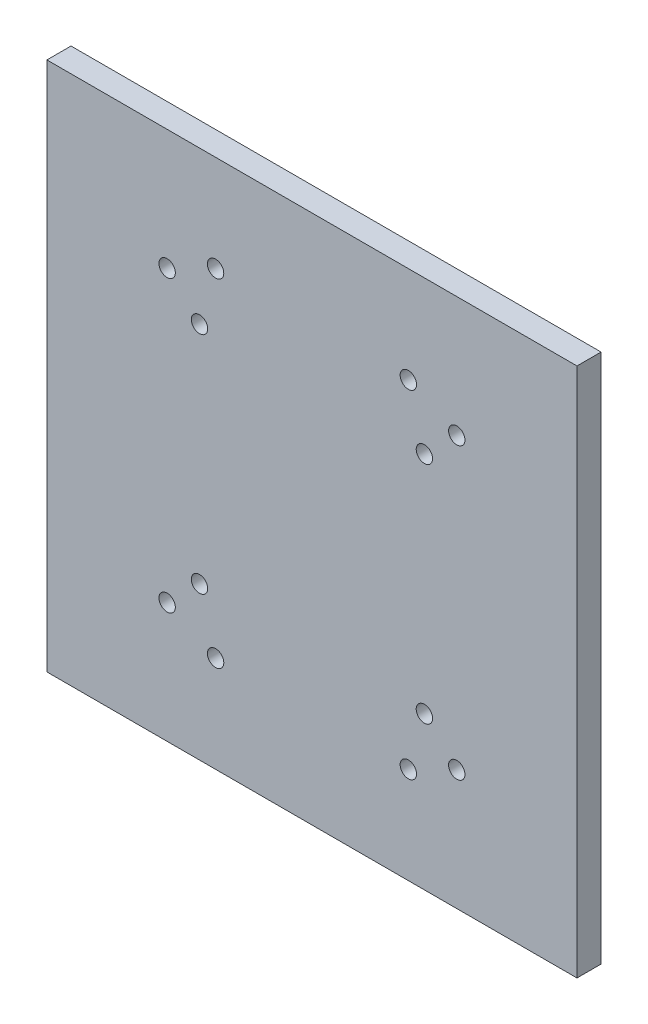
ISO-10303-21;
HEADER;
FILE_DESCRIPTION(('STEP AP214'),'2;1');
FILE_NAME('part.step','',(''),(''),'','','');
FILE_SCHEMA(('AUTOMOTIVE_DESIGN { 1 0 10303 214 1 1 1 1 }'));
ENDSEC;
DATA;
#1=APPLICATION_CONTEXT('core data for automotive mechanical design processes');
#2=APPLICATION_PROTOCOL_DEFINITION('international standard','automotive_design',2000,#1);
#3=PRODUCT_CONTEXT('',#1,'mechanical');
#4=PRODUCT('Part','Part','',(#3));
#5=PRODUCT_RELATED_PRODUCT_CATEGORY('part','',(#4));
#6=PRODUCT_DEFINITION_FORMATION('','',#4);
#7=PRODUCT_DEFINITION_CONTEXT('part definition',#1,'design');
#8=PRODUCT_DEFINITION('design','',#6,#7);
#9=PRODUCT_DEFINITION_SHAPE('','',#8);
#10=(LENGTH_UNIT() NAMED_UNIT(*) SI_UNIT(.MILLI.,.METRE.));
#11=(NAMED_UNIT(*) PLANE_ANGLE_UNIT() SI_UNIT($,.RADIAN.));
#12=(NAMED_UNIT(*) SI_UNIT($,.STERADIAN.) SOLID_ANGLE_UNIT());
#13=UNCERTAINTY_MEASURE_WITH_UNIT(LENGTH_MEASURE(1.E-05),#10,'distance_accuracy_value','');
#14=(GEOMETRIC_REPRESENTATION_CONTEXT(3) GLOBAL_UNCERTAINTY_ASSIGNED_CONTEXT((#13)) GLOBAL_UNIT_ASSIGNED_CONTEXT((#10,
#11,#12)) REPRESENTATION_CONTEXT('',''));
#15=CARTESIAN_POINT('',(0.,0.,0.));
#16=DIRECTION('',(0.,0.,1.));
#17=DIRECTION('',(1.,0.,0.));
#18=AXIS2_PLACEMENT_3D('',#15,#16,#17);
#19=CARTESIAN_POINT('',(110.,-110.,10.));
#20=DIRECTION('',(-1.,0.,0.));
#21=DIRECTION('',(0.,0.,1.));
#22=AXIS2_PLACEMENT_3D('',#19,#20,#21);
#23=PLANE('',#22);
#24=DIRECTION('',(0.,1.,0.));
#25=VECTOR('',#24,1.);
#26=CARTESIAN_POINT('',(110.,-110.,0.));
#27=LINE('',#26,#25);
#28=CARTESIAN_POINT('',(110.,-110.,0.));
#29=VERTEX_POINT('',#28);
#30=CARTESIAN_POINT('',(110.,110.,0.));
#31=VERTEX_POINT('',#30);
#32=EDGE_CURVE('E106',#29,#31,#27,.T.);
#33=ORIENTED_EDGE('',*,*,#32,.T.);
#34=DIRECTION('',(0.,0.,-1.));
#35=VECTOR('',#34,1.);
#36=CARTESIAN_POINT('',(110.,110.,10.));
#37=LINE('',#36,#35);
#38=CARTESIAN_POINT('',(110.,110.,10.));
#39=VERTEX_POINT('',#38);
#40=EDGE_CURVE('E11',#39,#31,#37,.T.);
#41=ORIENTED_EDGE('',*,*,#40,.F.);
#42=DIRECTION('',(0.,1.,0.));
#43=VECTOR('',#42,1.);
#44=CARTESIAN_POINT('',(110.,-110.,10.));
#45=LINE('',#44,#43);
#46=CARTESIAN_POINT('',(110.,-110.,10.));
#47=VERTEX_POINT('',#46);
#48=EDGE_CURVE('E90',#47,#39,#45,.T.);
#49=ORIENTED_EDGE('',*,*,#48,.F.);
#50=DIRECTION('',(0.,0.,-1.));
#51=VECTOR('',#50,1.);
#52=CARTESIAN_POINT('',(110.,-110.,10.));
#53=LINE('',#52,#51);
#54=EDGE_CURVE('E102',#47,#29,#53,.T.);
#55=ORIENTED_EDGE('',*,*,#54,.T.);
#56=EDGE_LOOP('',(#33,#41,#49,#55));
#57=FACE_BOUND('',#56,.T.);
#58=ADVANCED_FACE('F38',(#57),#23,.F.);
#59=CARTESIAN_POINT('',(-110.,110.,10.));
#60=DIRECTION('',(0.,-1.,0.));
#61=DIRECTION('',(0.,0.,-1.));
#62=AXIS2_PLACEMENT_3D('',#59,#60,#61);
#63=PLANE('',#62);
#64=DIRECTION('',(-1.,0.,0.));
#65=VECTOR('',#64,1.);
#66=CARTESIAN_POINT('',(-110.,110.,0.));
#67=LINE('',#66,#65);
#68=CARTESIAN_POINT('',(-110.,110.,0.));
#69=VERTEX_POINT('',#68);
#70=EDGE_CURVE('E95',#31,#69,#67,.T.);
#71=ORIENTED_EDGE('',*,*,#70,.T.);
#72=DIRECTION('',(0.,0.,-1.));
#73=VECTOR('',#72,1.);
#74=CARTESIAN_POINT('',(-110.,110.,10.));
#75=LINE('',#74,#73);
#76=CARTESIAN_POINT('',(-110.,110.,10.));
#77=VERTEX_POINT('',#76);
#78=EDGE_CURVE('E47',#77,#69,#75,.T.);
#79=ORIENTED_EDGE('',*,*,#78,.F.);
#80=DIRECTION('',(-1.,0.,0.));
#81=VECTOR('',#80,1.);
#82=CARTESIAN_POINT('',(-110.,110.,10.));
#83=LINE('',#82,#81);
#84=EDGE_CURVE('E85',#39,#77,#83,.T.);
#85=ORIENTED_EDGE('',*,*,#84,.F.);
#86=ORIENTED_EDGE('',*,*,#40,.T.);
#87=EDGE_LOOP('',(#71,#79,#85,#86));
#88=FACE_BOUND('',#87,.T.);
#89=ADVANCED_FACE('F94',(#88),#63,.F.);
#90=CARTESIAN_POINT('',(-110.,-110.,10.));
#91=DIRECTION('',(1.,0.,0.));
#92=DIRECTION('',(0.,0.,-1.));
#93=AXIS2_PLACEMENT_3D('',#90,#91,#92);
#94=PLANE('',#93);
#95=DIRECTION('',(0.,-1.,0.));
#96=VECTOR('',#95,1.);
#97=CARTESIAN_POINT('',(-110.,-110.,0.));
#98=LINE('',#97,#96);
#99=CARTESIAN_POINT('',(-110.,-110.,0.));
#100=VERTEX_POINT('',#99);
#101=EDGE_CURVE('E72',#69,#100,#98,.T.);
#102=ORIENTED_EDGE('',*,*,#101,.T.);
#103=DIRECTION('',(0.,0.,-1.));
#104=VECTOR('',#103,1.);
#105=CARTESIAN_POINT('',(-110.,-110.,10.));
#106=LINE('',#105,#104);
#107=CARTESIAN_POINT('',(-110.,-110.,10.));
#108=VERTEX_POINT('',#107);
#109=EDGE_CURVE('E97',#108,#100,#106,.T.);
#110=ORIENTED_EDGE('',*,*,#109,.F.);
#111=DIRECTION('',(0.,-1.,0.));
#112=VECTOR('',#111,1.);
#113=CARTESIAN_POINT('',(-110.,-110.,10.));
#114=LINE('',#113,#112);
#115=EDGE_CURVE('E88',#77,#108,#114,.T.);
#116=ORIENTED_EDGE('',*,*,#115,.F.);
#117=ORIENTED_EDGE('',*,*,#78,.T.);
#118=EDGE_LOOP('',(#102,#110,#116,#117));
#119=FACE_BOUND('',#118,.T.);
#120=ADVANCED_FACE('F98',(#119),#94,.F.);
#121=CARTESIAN_POINT('',(-110.,-110.,10.));
#122=DIRECTION('',(0.,1.,0.));
#123=DIRECTION('',(0.,0.,1.));
#124=AXIS2_PLACEMENT_3D('',#121,#122,#123);
#125=PLANE('',#124);
#126=DIRECTION('',(1.,0.,0.));
#127=VECTOR('',#126,1.);
#128=CARTESIAN_POINT('',(-110.,-110.,0.));
#129=LINE('',#128,#127);
#130=EDGE_CURVE('E78',#100,#29,#129,.T.);
#131=ORIENTED_EDGE('',*,*,#130,.T.);
#132=ORIENTED_EDGE('',*,*,#54,.F.);
#133=DIRECTION('',(1.,0.,0.));
#134=VECTOR('',#133,1.);
#135=CARTESIAN_POINT('',(-110.,-110.,10.));
#136=LINE('',#135,#134);
#137=EDGE_CURVE('E55',#108,#47,#136,.T.);
#138=ORIENTED_EDGE('',*,*,#137,.F.);
#139=ORIENTED_EDGE('',*,*,#109,.T.);
#140=EDGE_LOOP('',(#131,#132,#138,#139));
#141=FACE_BOUND('',#140,.T.);
#142=ADVANCED_FACE('F120',(#141),#125,.F.);
#143=CARTESIAN_POINT('',(0.,0.,10.));
#144=DIRECTION('',(0.,0.,-1.));
#145=DIRECTION('',(-1.,0.,0.));
#146=AXIS2_PLACEMENT_3D('',#143,#144,#145);
#147=PLANE('',#146);
#148=CARTESIAN_POINT('',(-40.,-70.,10.));
#149=DIRECTION('',(0.,0.,1.));
#150=DIRECTION('',(-1.,0.,0.));
#151=AXIS2_PLACEMENT_3D('',#148,#149,#150);
#152=CIRCLE('',#151,3.4);
#153=CARTESIAN_POINT('',(-43.4,-70.,10.));
#154=VERTEX_POINT('',#153);
#155=EDGE_CURVE('E208',#154,#154,#152,.T.);
#156=ORIENTED_EDGE('',*,*,#155,.F.);
#157=EDGE_LOOP('',(#156));
#158=FACE_BOUND('',#157,.T.);
#159=CARTESIAN_POINT('',(40.,70.,10.));
#160=DIRECTION('',(0.,0.,1.));
#161=DIRECTION('',(-1.,0.,0.));
#162=AXIS2_PLACEMENT_3D('',#159,#160,#161);
#163=CIRCLE('',#162,3.4);
#164=CARTESIAN_POINT('',(36.6,70.,10.));
#165=VERTEX_POINT('',#164);
#166=EDGE_CURVE('E199',#165,#165,#163,.T.);
#167=ORIENTED_EDGE('',*,*,#166,.F.);
#168=EDGE_LOOP('',(#167));
#169=FACE_BOUND('',#168,.T.);
#170=CARTESIAN_POINT('',(-40.,70.,10.));
#171=DIRECTION('',(0.,0.,1.));
#172=DIRECTION('',(1.,0.,0.));
#173=AXIS2_PLACEMENT_3D('',#170,#171,#172);
#174=CIRCLE('',#173,3.4);
#175=CARTESIAN_POINT('',(-36.6,70.,10.));
#176=VERTEX_POINT('',#175);
#177=EDGE_CURVE('E215',#176,#176,#174,.T.);
#178=ORIENTED_EDGE('',*,*,#177,.F.);
#179=EDGE_LOOP('',(#178));
#180=FACE_BOUND('',#179,.T.);
#181=CARTESIAN_POINT('',(40.,-70.,10.));
#182=DIRECTION('',(0.,0.,1.));
#183=DIRECTION('',(1.,0.,0.));
#184=AXIS2_PLACEMENT_3D('',#181,#182,#183);
#185=CIRCLE('',#184,3.4);
#186=CARTESIAN_POINT('',(43.4,-70.,10.));
#187=VERTEX_POINT('',#186);
#188=EDGE_CURVE('E191',#187,#187,#185,.T.);
#189=ORIENTED_EDGE('',*,*,#188,.F.);
#190=EDGE_LOOP('',(#189));
#191=FACE_BOUND('',#190,.T.);
#192=CARTESIAN_POINT('',(46.6690475583122,-46.669047558312,10.));
#193=DIRECTION('',(0.,0.,1.));
#194=DIRECTION('',(1.,0.,0.));
#195=AXIS2_PLACEMENT_3D('',#192,#193,#194);
#196=CIRCLE('',#195,3.39999999999998);
#197=CARTESIAN_POINT('',(50.0690475583122,-46.669047558312,10.));
#198=VERTEX_POINT('',#197);
#199=EDGE_CURVE('E160',#198,#198,#196,.T.);
#200=ORIENTED_EDGE('',*,*,#199,.F.);
#201=EDGE_LOOP('',(#200));
#202=FACE_BOUND('',#201,.T.);
#203=CARTESIAN_POINT('',(-46.669047558312,-46.6690475583122,10.));
#204=DIRECTION('',(0.,0.,1.));
#205=DIRECTION('',(1.,0.,0.));
#206=AXIS2_PLACEMENT_3D('',#203,#204,#205);
#207=CIRCLE('',#206,3.4);
#208=CARTESIAN_POINT('',(-43.269047558312,-46.6690475583122,10.));
#209=VERTEX_POINT('',#208);
#210=EDGE_CURVE('E152',#209,#209,#207,.T.);
#211=ORIENTED_EDGE('',*,*,#210,.F.);
#212=EDGE_LOOP('',(#211));
#213=FACE_BOUND('',#212,.T.);
#214=CARTESIAN_POINT('',(-46.6690475583122,46.6690475583121,10.));
#215=DIRECTION('',(0.,0.,1.));
#216=DIRECTION('',(1.,0.,0.));
#217=AXIS2_PLACEMENT_3D('',#214,#215,#216);
#218=CIRCLE('',#217,3.4);
#219=CARTESIAN_POINT('',(-43.2690475583122,46.6690475583121,10.));
#220=VERTEX_POINT('',#219);
#221=EDGE_CURVE('E144',#220,#220,#218,.T.);
#222=ORIENTED_EDGE('',*,*,#221,.F.);
#223=EDGE_LOOP('',(#222));
#224=FACE_BOUND('',#223,.T.);
#225=CARTESIAN_POINT('',(60.1040764008565,60.1040764008565,10.));
#226=DIRECTION('',(0.,0.,1.));
#227=DIRECTION('',(1.,0.,0.));
#228=AXIS2_PLACEMENT_3D('',#225,#226,#227);
#229=CIRCLE('',#228,3.39999999999998);
#230=CARTESIAN_POINT('',(63.5040764008565,60.1040764008565,10.));
#231=VERTEX_POINT('',#230);
#232=EDGE_CURVE('E135',#231,#231,#229,.T.);
#233=ORIENTED_EDGE('',*,*,#232,.F.);
#234=EDGE_LOOP('',(#233));
#235=FACE_BOUND('',#234,.T.);
#236=CARTESIAN_POINT('',(60.1040764008563,-60.1040764008567,10.));
#237=DIRECTION('',(0.,0.,1.));
#238=DIRECTION('',(1.,0.,0.));
#239=AXIS2_PLACEMENT_3D('',#236,#237,#238);
#240=CIRCLE('',#239,3.39999999999999);
#241=CARTESIAN_POINT('',(63.5040764008563,-60.1040764008567,10.));
#242=VERTEX_POINT('',#241);
#243=EDGE_CURVE('E184',#242,#242,#240,.T.);
#244=ORIENTED_EDGE('',*,*,#243,.F.);
#245=EDGE_LOOP('',(#244));
#246=FACE_BOUND('',#245,.T.);
#247=CARTESIAN_POINT('',(-60.1040764008565,-60.1040764008566,10.));
#248=DIRECTION('',(0.,0.,1.));
#249=DIRECTION('',(1.,0.,0.));
#250=AXIS2_PLACEMENT_3D('',#247,#248,#249);
#251=CIRCLE('',#250,3.40000000000027);
#252=CARTESIAN_POINT('',(-56.7040764008563,-60.1040764008566,10.));
#253=VERTEX_POINT('',#252);
#254=EDGE_CURVE('E176',#253,#253,#251,.T.);
#255=ORIENTED_EDGE('',*,*,#254,.F.);
#256=EDGE_LOOP('',(#255));
#257=FACE_BOUND('',#256,.T.);
#258=CARTESIAN_POINT('',(-60.1040764008559,60.1040764008572,10.));
#259=DIRECTION('',(0.,0.,1.));
#260=DIRECTION('',(1.,0.,0.));
#261=AXIS2_PLACEMENT_3D('',#258,#259,#260);
#262=CIRCLE('',#261,3.39999999999999);
#263=CARTESIAN_POINT('',(-56.7040764008559,60.1040764008572,10.));
#264=VERTEX_POINT('',#263);
#265=EDGE_CURVE('E167',#264,#264,#262,.T.);
#266=ORIENTED_EDGE('',*,*,#265,.F.);
#267=EDGE_LOOP('',(#266));
#268=FACE_BOUND('',#267,.T.);
#269=CARTESIAN_POINT('',(46.669047558312,46.6690475583122,10.));
#270=DIRECTION('',(0.,0.,1.));
#271=DIRECTION('',(1.,0.,0.));
#272=AXIS2_PLACEMENT_3D('',#269,#270,#271);
#273=CIRCLE('',#272,3.4);
#274=CARTESIAN_POINT('',(50.0690475583121,46.6690475583122,10.));
#275=VERTEX_POINT('',#274);
#276=EDGE_CURVE('E127',#275,#275,#273,.T.);
#277=ORIENTED_EDGE('',*,*,#276,.F.);
#278=EDGE_LOOP('',(#277));
#279=FACE_BOUND('',#278,.T.);
#280=ORIENTED_EDGE('',*,*,#48,.T.);
#281=ORIENTED_EDGE('',*,*,#84,.T.);
#282=ORIENTED_EDGE('',*,*,#115,.T.);
#283=ORIENTED_EDGE('',*,*,#137,.T.);
#284=EDGE_LOOP('',(#280,#281,#282,#283));
#285=FACE_BOUND('',#284,.T.);
#286=ADVANCED_FACE('F86',(#158,#169,#180,#191,#202,#213,#224,#235,#246,#257,#268,#279,#285),
#147,.F.);
#287=CARTESIAN_POINT('',(0.,0.,0.));
#288=DIRECTION('',(0.,0.,-1.));
#289=DIRECTION('',(-1.,0.,0.));
#290=AXIS2_PLACEMENT_3D('',#287,#288,#289);
#291=PLANE('',#290);
#292=CARTESIAN_POINT('',(-40.,-70.,0.));
#293=DIRECTION('',(0.,0.,1.));
#294=DIRECTION('',(-1.,0.,0.));
#295=AXIS2_PLACEMENT_3D('',#292,#293,#294);
#296=CIRCLE('',#295,3.4);
#297=CARTESIAN_POINT('',(-43.4,-70.,0.));
#298=VERTEX_POINT('',#297);
#299=EDGE_CURVE('E195',#298,#298,#296,.T.);
#300=ORIENTED_EDGE('',*,*,#299,.T.);
#301=EDGE_LOOP('',(#300));
#302=FACE_BOUND('',#301,.T.);
#303=CARTESIAN_POINT('',(40.,70.,0.));
#304=DIRECTION('',(0.,0.,1.));
#305=DIRECTION('',(-1.,0.,0.));
#306=AXIS2_PLACEMENT_3D('',#303,#304,#305);
#307=CIRCLE('',#306,3.4);
#308=CARTESIAN_POINT('',(36.6,70.,0.));
#309=VERTEX_POINT('',#308);
#310=EDGE_CURVE('E203',#309,#309,#307,.T.);
#311=ORIENTED_EDGE('',*,*,#310,.T.);
#312=EDGE_LOOP('',(#311));
#313=FACE_BOUND('',#312,.T.);
#314=CARTESIAN_POINT('',(-40.,70.,0.));
#315=DIRECTION('',(0.,0.,1.));
#316=DIRECTION('',(1.,0.,0.));
#317=AXIS2_PLACEMENT_3D('',#314,#315,#316);
#318=CIRCLE('',#317,3.4);
#319=CARTESIAN_POINT('',(-36.6,70.,0.));
#320=VERTEX_POINT('',#319);
#321=EDGE_CURVE('E204',#320,#320,#318,.T.);
#322=ORIENTED_EDGE('',*,*,#321,.T.);
#323=EDGE_LOOP('',(#322));
#324=FACE_BOUND('',#323,.T.);
#325=CARTESIAN_POINT('',(40.,-70.,0.));
#326=DIRECTION('',(0.,0.,1.));
#327=DIRECTION('',(1.,0.,0.));
#328=AXIS2_PLACEMENT_3D('',#325,#326,#327);
#329=CIRCLE('',#328,3.4);
#330=CARTESIAN_POINT('',(43.4,-70.,0.));
#331=VERTEX_POINT('',#330);
#332=EDGE_CURVE('E172',#331,#331,#329,.T.);
#333=ORIENTED_EDGE('',*,*,#332,.T.);
#334=EDGE_LOOP('',(#333));
#335=FACE_BOUND('',#334,.T.);
#336=CARTESIAN_POINT('',(46.6690475583122,-46.669047558312,0.));
#337=DIRECTION('',(0.,0.,1.));
#338=DIRECTION('',(1.,0.,0.));
#339=AXIS2_PLACEMENT_3D('',#336,#337,#338);
#340=CIRCLE('',#339,3.39999999999998);
#341=CARTESIAN_POINT('',(50.0690475583122,-46.669047558312,0.));
#342=VERTEX_POINT('',#341);
#343=EDGE_CURVE('E131',#342,#342,#340,.T.);
#344=ORIENTED_EDGE('',*,*,#343,.T.);
#345=EDGE_LOOP('',(#344));
#346=FACE_BOUND('',#345,.T.);
#347=CARTESIAN_POINT('',(-46.669047558312,-46.6690475583122,0.));
#348=DIRECTION('',(0.,0.,1.));
#349=DIRECTION('',(1.,0.,0.));
#350=AXIS2_PLACEMENT_3D('',#347,#348,#349);
#351=CIRCLE('',#350,3.4);
#352=CARTESIAN_POINT('',(-43.269047558312,-46.6690475583122,0.));
#353=VERTEX_POINT('',#352);
#354=EDGE_CURVE('E156',#353,#353,#351,.T.);
#355=ORIENTED_EDGE('',*,*,#354,.T.);
#356=EDGE_LOOP('',(#355));
#357=FACE_BOUND('',#356,.T.);
#358=CARTESIAN_POINT('',(-46.6690475583122,46.6690475583121,0.));
#359=DIRECTION('',(0.,0.,1.));
#360=DIRECTION('',(1.,0.,0.));
#361=AXIS2_PLACEMENT_3D('',#358,#359,#360);
#362=CIRCLE('',#361,3.4);
#363=CARTESIAN_POINT('',(-43.2690475583122,46.6690475583121,0.));
#364=VERTEX_POINT('',#363);
#365=EDGE_CURVE('E148',#364,#364,#362,.T.);
#366=ORIENTED_EDGE('',*,*,#365,.T.);
#367=EDGE_LOOP('',(#366));
#368=FACE_BOUND('',#367,.T.);
#369=CARTESIAN_POINT('',(60.1040764008565,60.1040764008565,0.));
#370=DIRECTION('',(0.,0.,1.));
#371=DIRECTION('',(1.,0.,0.));
#372=AXIS2_PLACEMENT_3D('',#369,#370,#371);
#373=CIRCLE('',#372,3.39999999999998);
#374=CARTESIAN_POINT('',(63.5040764008565,60.1040764008565,0.));
#375=VERTEX_POINT('',#374);
#376=EDGE_CURVE('E139',#375,#375,#373,.T.);
#377=ORIENTED_EDGE('',*,*,#376,.T.);
#378=EDGE_LOOP('',(#377));
#379=FACE_BOUND('',#378,.T.);
#380=CARTESIAN_POINT('',(60.1040764008563,-60.1040764008567,0.));
#381=DIRECTION('',(0.,0.,1.));
#382=DIRECTION('',(1.,0.,0.));
#383=AXIS2_PLACEMENT_3D('',#380,#381,#382);
#384=CIRCLE('',#383,3.39999999999999);
#385=CARTESIAN_POINT('',(63.5040764008563,-60.1040764008567,0.));
#386=VERTEX_POINT('',#385);
#387=EDGE_CURVE('E140',#386,#386,#384,.T.);
#388=ORIENTED_EDGE('',*,*,#387,.T.);
#389=EDGE_LOOP('',(#388));
#390=FACE_BOUND('',#389,.T.);
#391=CARTESIAN_POINT('',(-60.1040764008565,-60.1040764008566,0.));
#392=DIRECTION('',(0.,0.,1.));
#393=DIRECTION('',(1.,0.,0.));
#394=AXIS2_PLACEMENT_3D('',#391,#392,#393);
#395=CIRCLE('',#394,3.40000000000027);
#396=CARTESIAN_POINT('',(-56.7040764008563,-60.1040764008566,0.));
#397=VERTEX_POINT('',#396);
#398=EDGE_CURVE('E180',#397,#397,#395,.T.);
#399=ORIENTED_EDGE('',*,*,#398,.T.);
#400=EDGE_LOOP('',(#399));
#401=FACE_BOUND('',#400,.T.);
#402=CARTESIAN_POINT('',(-60.1040764008559,60.1040764008572,0.));
#403=DIRECTION('',(0.,0.,1.));
#404=DIRECTION('',(1.,0.,0.));
#405=AXIS2_PLACEMENT_3D('',#402,#403,#404);
#406=CIRCLE('',#405,3.39999999999999);
#407=CARTESIAN_POINT('',(-56.7040764008559,60.1040764008572,0.));
#408=VERTEX_POINT('',#407);
#409=EDGE_CURVE('E171',#408,#408,#406,.T.);
#410=ORIENTED_EDGE('',*,*,#409,.T.);
#411=EDGE_LOOP('',(#410));
#412=FACE_BOUND('',#411,.T.);
#413=CARTESIAN_POINT('',(46.669047558312,46.6690475583122,0.));
#414=DIRECTION('',(0.,0.,1.));
#415=DIRECTION('',(1.,0.,0.));
#416=AXIS2_PLACEMENT_3D('',#413,#414,#415);
#417=CIRCLE('',#416,3.4);
#418=CARTESIAN_POINT('',(50.0690475583121,46.6690475583122,0.));
#419=VERTEX_POINT('',#418);
#420=EDGE_CURVE('E110',#419,#419,#417,.T.);
#421=ORIENTED_EDGE('',*,*,#420,.T.);
#422=EDGE_LOOP('',(#421));
#423=FACE_BOUND('',#422,.T.);
#424=ORIENTED_EDGE('',*,*,#32,.F.);
#425=ORIENTED_EDGE('',*,*,#130,.F.);
#426=ORIENTED_EDGE('',*,*,#101,.F.);
#427=ORIENTED_EDGE('',*,*,#70,.F.);
#428=EDGE_LOOP('',(#424,#425,#426,#427));
#429=FACE_BOUND('',#428,.T.);
#430=ADVANCED_FACE('F123',(#302,#313,#324,#335,#346,#357,#368,#379,#390,#401,#412,#423,#429),
#291,.T.);
#431=CARTESIAN_POINT('',(46.669047558312,46.6690475583122,0.));
#432=DIRECTION('',(0.,0.,1.));
#433=DIRECTION('',(1.,0.,0.));
#434=AXIS2_PLACEMENT_3D('',#431,#432,#433);
#435=CYLINDRICAL_SURFACE('',#434,3.4);
#436=ORIENTED_EDGE('',*,*,#420,.F.);
#437=EDGE_LOOP('',(#436));
#438=FACE_BOUND('',#437,.T.);
#439=ORIENTED_EDGE('',*,*,#276,.T.);
#440=EDGE_LOOP('',(#439));
#441=FACE_BOUND('',#440,.T.);
#442=ADVANCED_FACE('F255',(#438,#441),#435,.F.);
#443=CARTESIAN_POINT('',(-60.1040764008559,60.1040764008572,0.));
#444=DIRECTION('',(0.,0.,1.));
#445=DIRECTION('',(1.,0.,0.));
#446=AXIS2_PLACEMENT_3D('',#443,#444,#445);
#447=CYLINDRICAL_SURFACE('',#446,3.39999999999999);
#448=ORIENTED_EDGE('',*,*,#409,.F.);
#449=EDGE_LOOP('',(#448));
#450=FACE_BOUND('',#449,.T.);
#451=ORIENTED_EDGE('',*,*,#265,.T.);
#452=EDGE_LOOP('',(#451));
#453=FACE_BOUND('',#452,.T.);
#454=ADVANCED_FACE('F257',(#450,#453),#447,.F.);
#455=CARTESIAN_POINT('',(-60.1040764008565,-60.1040764008566,0.));
#456=DIRECTION('',(0.,0.,1.));
#457=DIRECTION('',(1.,0.,0.));
#458=AXIS2_PLACEMENT_3D('',#455,#456,#457);
#459=CYLINDRICAL_SURFACE('',#458,3.40000000000027);
#460=ORIENTED_EDGE('',*,*,#398,.F.);
#461=EDGE_LOOP('',(#460));
#462=FACE_BOUND('',#461,.T.);
#463=ORIENTED_EDGE('',*,*,#254,.T.);
#464=EDGE_LOOP('',(#463));
#465=FACE_BOUND('',#464,.T.);
#466=ADVANCED_FACE('F264',(#462,#465),#459,.F.);
#467=CARTESIAN_POINT('',(60.1040764008563,-60.1040764008567,0.));
#468=DIRECTION('',(0.,0.,1.));
#469=DIRECTION('',(1.,0.,0.));
#470=AXIS2_PLACEMENT_3D('',#467,#468,#469);
#471=CYLINDRICAL_SURFACE('',#470,3.39999999999999);
#472=ORIENTED_EDGE('',*,*,#387,.F.);
#473=EDGE_LOOP('',(#472));
#474=FACE_BOUND('',#473,.T.);
#475=ORIENTED_EDGE('',*,*,#243,.T.);
#476=EDGE_LOOP('',(#475));
#477=FACE_BOUND('',#476,.T.);
#478=ADVANCED_FACE('F341',(#474,#477),#471,.F.);
#479=CARTESIAN_POINT('',(60.1040764008565,60.1040764008565,0.));
#480=DIRECTION('',(0.,0.,1.));
#481=DIRECTION('',(1.,0.,0.));
#482=AXIS2_PLACEMENT_3D('',#479,#480,#481);
#483=CYLINDRICAL_SURFACE('',#482,3.39999999999998);
#484=ORIENTED_EDGE('',*,*,#376,.F.);
#485=EDGE_LOOP('',(#484));
#486=FACE_BOUND('',#485,.T.);
#487=ORIENTED_EDGE('',*,*,#232,.T.);
#488=EDGE_LOOP('',(#487));
#489=FACE_BOUND('',#488,.T.);
#490=ADVANCED_FACE('F344',(#486,#489),#483,.F.);
#491=CARTESIAN_POINT('',(-46.6690475583122,46.6690475583121,0.));
#492=DIRECTION('',(0.,0.,1.));
#493=DIRECTION('',(1.,0.,0.));
#494=AXIS2_PLACEMENT_3D('',#491,#492,#493);
#495=CYLINDRICAL_SURFACE('',#494,3.4);
#496=ORIENTED_EDGE('',*,*,#365,.F.);
#497=EDGE_LOOP('',(#496));
#498=FACE_BOUND('',#497,.T.);
#499=ORIENTED_EDGE('',*,*,#221,.T.);
#500=EDGE_LOOP('',(#499));
#501=FACE_BOUND('',#500,.T.);
#502=ADVANCED_FACE('F354',(#498,#501),#495,.F.);
#503=CARTESIAN_POINT('',(-46.669047558312,-46.6690475583122,0.));
#504=DIRECTION('',(0.,0.,1.));
#505=DIRECTION('',(1.,0.,0.));
#506=AXIS2_PLACEMENT_3D('',#503,#504,#505);
#507=CYLINDRICAL_SURFACE('',#506,3.4);
#508=ORIENTED_EDGE('',*,*,#354,.F.);
#509=EDGE_LOOP('',(#508));
#510=FACE_BOUND('',#509,.T.);
#511=ORIENTED_EDGE('',*,*,#210,.T.);
#512=EDGE_LOOP('',(#511));
#513=FACE_BOUND('',#512,.T.);
#514=ADVANCED_FACE('F350',(#510,#513),#507,.F.);
#515=CARTESIAN_POINT('',(46.6690475583122,-46.669047558312,0.));
#516=DIRECTION('',(0.,0.,1.));
#517=DIRECTION('',(1.,0.,0.));
#518=AXIS2_PLACEMENT_3D('',#515,#516,#517);
#519=CYLINDRICAL_SURFACE('',#518,3.39999999999998);
#520=ORIENTED_EDGE('',*,*,#343,.F.);
#521=EDGE_LOOP('',(#520));
#522=FACE_BOUND('',#521,.T.);
#523=ORIENTED_EDGE('',*,*,#199,.T.);
#524=EDGE_LOOP('',(#523));
#525=FACE_BOUND('',#524,.T.);
#526=ADVANCED_FACE('F306',(#522,#525),#519,.F.);
#527=CARTESIAN_POINT('',(40.,-70.,0.));
#528=DIRECTION('',(0.,0.,1.));
#529=DIRECTION('',(1.,0.,0.));
#530=AXIS2_PLACEMENT_3D('',#527,#528,#529);
#531=CYLINDRICAL_SURFACE('',#530,3.4);
#532=ORIENTED_EDGE('',*,*,#332,.F.);
#533=EDGE_LOOP('',(#532));
#534=FACE_BOUND('',#533,.T.);
#535=ORIENTED_EDGE('',*,*,#188,.T.);
#536=EDGE_LOOP('',(#535));
#537=FACE_BOUND('',#536,.T.);
#538=ADVANCED_FACE('F229',(#534,#537),#531,.F.);
#539=CARTESIAN_POINT('',(-40.,70.,0.));
#540=DIRECTION('',(0.,0.,1.));
#541=DIRECTION('',(1.,0.,0.));
#542=AXIS2_PLACEMENT_3D('',#539,#540,#541);
#543=CYLINDRICAL_SURFACE('',#542,3.4);
#544=ORIENTED_EDGE('',*,*,#321,.F.);
#545=EDGE_LOOP('',(#544));
#546=FACE_BOUND('',#545,.T.);
#547=ORIENTED_EDGE('',*,*,#177,.T.);
#548=EDGE_LOOP('',(#547));
#549=FACE_BOUND('',#548,.T.);
#550=ADVANCED_FACE('F225',(#546,#549),#543,.F.);
#551=CARTESIAN_POINT('',(40.,70.,0.));
#552=DIRECTION('',(0.,0.,1.));
#553=DIRECTION('',(1.,0.,0.));
#554=AXIS2_PLACEMENT_3D('',#551,#552,#553);
#555=CYLINDRICAL_SURFACE('',#554,3.4);
#556=ORIENTED_EDGE('',*,*,#310,.F.);
#557=EDGE_LOOP('',(#556));
#558=FACE_BOUND('',#557,.T.);
#559=ORIENTED_EDGE('',*,*,#166,.T.);
#560=EDGE_LOOP('',(#559));
#561=FACE_BOUND('',#560,.T.);
#562=ADVANCED_FACE('F228',(#558,#561),#555,.F.);
#563=CARTESIAN_POINT('',(-40.,-70.,0.));
#564=DIRECTION('',(0.,0.,1.));
#565=DIRECTION('',(1.,0.,0.));
#566=AXIS2_PLACEMENT_3D('',#563,#564,#565);
#567=CYLINDRICAL_SURFACE('',#566,3.4);
#568=ORIENTED_EDGE('',*,*,#299,.F.);
#569=EDGE_LOOP('',(#568));
#570=FACE_BOUND('',#569,.T.);
#571=ORIENTED_EDGE('',*,*,#155,.T.);
#572=EDGE_LOOP('',(#571));
#573=FACE_BOUND('',#572,.T.);
#574=ADVANCED_FACE('F324',(#570,#573),#567,.F.);
#575=CLOSED_SHELL('',(#58,#89,#120,#142,#286,#430,#442,#454,#466,#478,#490,#502,#514,#526,#538,
#550,#562,#574));
#576=MANIFOLD_SOLID_BREP('B2',#575);
#577=ADVANCED_BREP_SHAPE_REPRESENTATION('',(#18,#576),#14);
#578=SHAPE_DEFINITION_REPRESENTATION(#9,#577);
ENDSEC;
END-ISO-10303-21;
